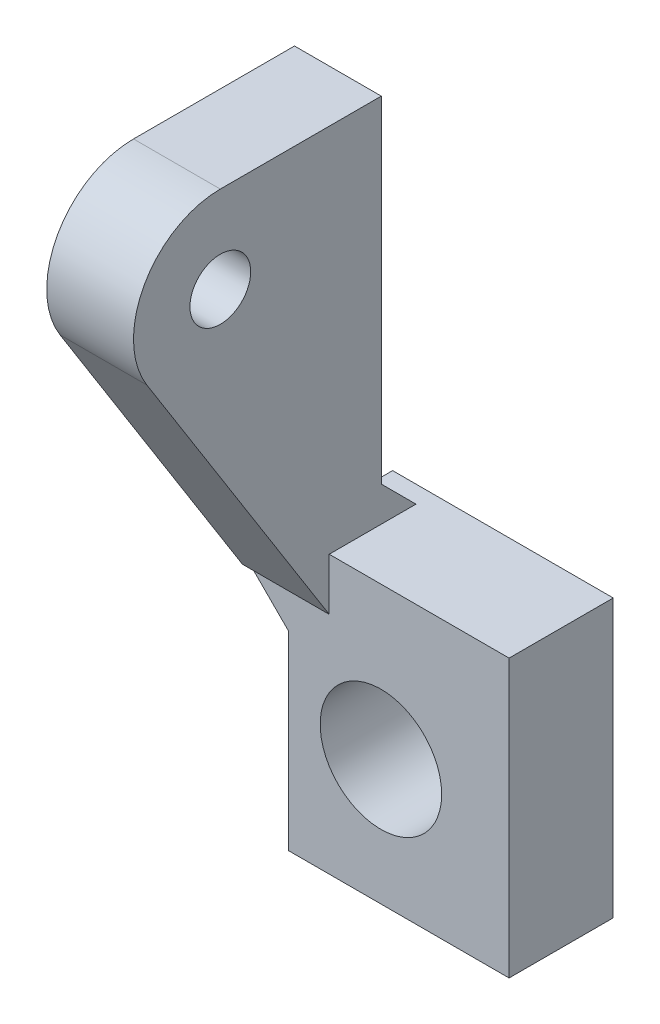
ISO-10303-21;
HEADER;
FILE_DESCRIPTION(('STEP AP214'),'2;1');
FILE_NAME('part.step','',(''),(''),'','','');
FILE_SCHEMA(('AUTOMOTIVE_DESIGN { 1 0 10303 214 1 1 1 1 }'));
ENDSEC;
DATA;
#1=APPLICATION_CONTEXT('core data for automotive mechanical design processes');
#2=APPLICATION_PROTOCOL_DEFINITION('international standard','automotive_design',2000,#1);
#3=PRODUCT_CONTEXT('',#1,'mechanical');
#4=PRODUCT('Part','Part','',(#3));
#5=PRODUCT_RELATED_PRODUCT_CATEGORY('part','',(#4));
#6=PRODUCT_DEFINITION_FORMATION('','',#4);
#7=PRODUCT_DEFINITION_CONTEXT('part definition',#1,'design');
#8=PRODUCT_DEFINITION('design','',#6,#7);
#9=PRODUCT_DEFINITION_SHAPE('','',#8);
#10=(LENGTH_UNIT() NAMED_UNIT(*) SI_UNIT(.MILLI.,.METRE.));
#11=(NAMED_UNIT(*) PLANE_ANGLE_UNIT() SI_UNIT($,.RADIAN.));
#12=(NAMED_UNIT(*) SI_UNIT($,.STERADIAN.) SOLID_ANGLE_UNIT());
#13=UNCERTAINTY_MEASURE_WITH_UNIT(LENGTH_MEASURE(1.E-05),#10,'distance_accuracy_value','');
#14=(GEOMETRIC_REPRESENTATION_CONTEXT(3) GLOBAL_UNCERTAINTY_ASSIGNED_CONTEXT((#13)) GLOBAL_UNIT_ASSIGNED_CONTEXT((#10,
#11,#12)) REPRESENTATION_CONTEXT('',''));
#15=CARTESIAN_POINT('',(0.,0.,0.));
#16=DIRECTION('',(0.,0.,1.));
#17=DIRECTION('',(1.,0.,0.));
#18=AXIS2_PLACEMENT_3D('',#15,#16,#17);
#19=CARTESIAN_POINT('',(0.,0.,47.41148));
#20=DIRECTION('',(0.,0.,-1.));
#21=DIRECTION('',(-1.,0.,0.));
#22=AXIS2_PLACEMENT_3D('',#19,#20,#21);
#23=PLANE('',#22);
#24=CARTESIAN_POINT('',(38.4788523967918,6.56657386274739,47.41148));
#25=DIRECTION('',(0.,0.,1.));
#26=DIRECTION('',(1.,0.,0.));
#27=AXIS2_PLACEMENT_3D('',#24,#25,#26);
#28=CIRCLE('',#27,1.8);
#29=CARTESIAN_POINT('',(40.2788523967918,6.56657386274739,47.41148));
#30=VERTEX_POINT('',#29);
#31=EDGE_CURVE('E221',#30,#30,#28,.T.);
#32=ORIENTED_EDGE('',*,*,#31,.F.);
#33=EDGE_LOOP('',(#32));
#34=FACE_BOUND('',#33,.T.);
#35=CARTESIAN_POINT('',(38.4788523967918,6.56657386274739,47.41148));
#36=DIRECTION('',(0.,0.,1.));
#37=DIRECTION('',(1.,0.,0.));
#38=AXIS2_PLACEMENT_3D('',#35,#36,#37);
#39=CIRCLE('',#38,3.5);
#40=CARTESIAN_POINT('',(41.9788523967918,6.56657386274739,47.41148));
#41=VERTEX_POINT('',#40);
#42=EDGE_CURVE('E279',#41,#41,#39,.T.);
#43=ORIENTED_EDGE('',*,*,#42,.T.);
#44=EDGE_LOOP('',(#43));
#45=FACE_BOUND('',#44,.T.);
#46=ADVANCED_FACE('F39',(#34,#45),#23,.F.);
#47=CARTESIAN_POINT('',(35.4999999999996,12.3085599551472,47.41148));
#48=DIRECTION('',(0.,1.,0.));
#49=DIRECTION('',(-1.,0.,0.));
#50=AXIS2_PLACEMENT_3D('',#47,#48,#49);
#51=PLANE('',#50);
#52=DIRECTION('',(-1.,0.,0.));
#53=VECTOR('',#52,1.);
#54=CARTESIAN_POINT('',(35.4999999999996,12.3085599551472,47.41148));
#55=LINE('',#54,#53);
#56=CARTESIAN_POINT('',(31.1528408173078,12.3085599551471,47.41148));
#57=VERTEX_POINT('',#56);
#58=CARTESIAN_POINT('',(30.4999999999996,12.3085599551471,47.41148));
#59=VERTEX_POINT('',#58);
#60=EDGE_CURVE('E212',#57,#59,#55,.T.);
#61=ORIENTED_EDGE('',*,*,#60,.F.);
#62=DIRECTION('',(0.,0.,1.));
#63=VECTOR('',#62,1.);
#64=CARTESIAN_POINT('',(31.1528408173078,12.3085599551471,52.41148));
#65=LINE('',#64,#63);
#66=CARTESIAN_POINT('',(31.1528408173078,12.3085599551471,52.41148));
#67=VERTEX_POINT('',#66);
#68=EDGE_CURVE('E242',#57,#67,#65,.T.);
#69=ORIENTED_EDGE('',*,*,#68,.T.);
#70=DIRECTION('',(-1.,0.,0.));
#71=VECTOR('',#70,1.);
#72=CARTESIAN_POINT('',(35.4999999999996,12.3085599551472,52.41148));
#73=LINE('',#72,#71);
#74=CARTESIAN_POINT('',(30.4999999999996,12.3085599551471,52.41148));
#75=VERTEX_POINT('',#74);
#76=EDGE_CURVE('E214',#67,#75,#73,.T.);
#77=ORIENTED_EDGE('',*,*,#76,.T.);
#78=DIRECTION('',(0.,0.,-1.));
#79=VECTOR('',#78,1.);
#80=CARTESIAN_POINT('',(30.4999999999996,12.3085599551471,47.41148));
#81=LINE('',#80,#79);
#82=EDGE_CURVE('E189',#75,#59,#81,.T.);
#83=ORIENTED_EDGE('',*,*,#82,.T.);
#84=EDGE_LOOP('',(#61,#69,#77,#83));
#85=FACE_BOUND('',#84,.T.);
#86=ADVANCED_FACE('F247',(#85),#51,.F.);
#87=CARTESIAN_POINT('',(0.,0.,46.41148));
#88=DIRECTION('',(0.,0.,-1.));
#89=DIRECTION('',(-1.,0.,0.));
#90=AXIS2_PLACEMENT_3D('',#87,#88,#89);
#91=PLANE('',#90);
#92=DIRECTION('',(0.,-1.,0.));
#93=VECTOR('',#92,1.);
#94=CARTESIAN_POINT('',(33.1528408173078,-0.654992050270078,46.41148));
#95=LINE('',#94,#93);
#96=CARTESIAN_POINT('',(33.1528408173078,15.3085599551472,46.41148));
#97=VERTEX_POINT('',#96);
#98=CARTESIAN_POINT('',(33.1528408173078,-0.654992050270078,46.41148));
#99=VERTEX_POINT('',#98);
#100=EDGE_CURVE('E150',#97,#99,#95,.T.);
#101=ORIENTED_EDGE('',*,*,#100,.F.);
#102=DIRECTION('',(-1.,0.,0.));
#103=VECTOR('',#102,1.);
#104=CARTESIAN_POINT('',(33.1528408173078,15.3085599551472,46.41148));
#105=LINE('',#104,#103);
#106=CARTESIAN_POINT('',(45.8637656044632,15.3085599551472,46.41148));
#107=VERTEX_POINT('',#106);
#108=EDGE_CURVE('E229',#107,#97,#105,.T.);
#109=ORIENTED_EDGE('',*,*,#108,.F.);
#110=DIRECTION('',(0.,1.,0.));
#111=VECTOR('',#110,1.);
#112=CARTESIAN_POINT('',(45.8637656044632,-0.654992050270078,46.41148));
#113=LINE('',#112,#111);
#114=CARTESIAN_POINT('',(45.8637656044632,-0.654992050270078,46.41148));
#115=VERTEX_POINT('',#114);
#116=EDGE_CURVE('E233',#115,#107,#113,.T.);
#117=ORIENTED_EDGE('',*,*,#116,.F.);
#118=DIRECTION('',(1.,0.,0.));
#119=VECTOR('',#118,1.);
#120=CARTESIAN_POINT('',(33.1528408173078,-0.654992050270078,46.41148));
#121=LINE('',#120,#119);
#122=EDGE_CURVE('E231',#99,#115,#121,.T.);
#123=ORIENTED_EDGE('',*,*,#122,.F.);
#124=EDGE_LOOP('',(#101,#109,#117,#123));
#125=FACE_BOUND('',#124,.T.);
#126=CARTESIAN_POINT('',(38.4788523967918,6.56657386274739,46.41148));
#127=DIRECTION('',(0.,0.,1.));
#128=DIRECTION('',(1.,0.,0.));
#129=AXIS2_PLACEMENT_3D('',#126,#127,#128);
#130=CIRCLE('',#129,1.8);
#131=CARTESIAN_POINT('',(40.2788523967918,6.56657386274739,46.41148));
#132=VERTEX_POINT('',#131);
#133=EDGE_CURVE('E220',#132,#132,#130,.T.);
#134=ORIENTED_EDGE('',*,*,#133,.T.);
#135=EDGE_LOOP('',(#134));
#136=FACE_BOUND('',#135,.T.);
#137=ADVANCED_FACE('F271',(#125,#136),#91,.T.);
#138=CARTESIAN_POINT('',(33.1528408173078,-0.654992050270078,47.41148));
#139=DIRECTION('',(1.,0.,0.));
#140=DIRECTION('',(0.,0.,-1.));
#141=AXIS2_PLACEMENT_3D('',#138,#139,#140);
#142=PLANE('',#141);
#143=DIRECTION('',(0.,-1.,0.));
#144=VECTOR('',#143,1.);
#145=CARTESIAN_POINT('',(33.1528408173078,12.3085599551471,52.41148));
#146=LINE('',#145,#144);
#147=CARTESIAN_POINT('',(33.1528408173078,10.3085599551471,52.41148));
#148=VERTEX_POINT('',#147);
#149=CARTESIAN_POINT('',(33.1528408173078,-0.654992050270078,52.41148));
#150=VERTEX_POINT('',#149);
#151=EDGE_CURVE('E129',#148,#150,#146,.T.);
#152=ORIENTED_EDGE('',*,*,#151,.F.);
#153=DIRECTION('',(0.,0.,-1.));
#154=VECTOR('',#153,1.);
#155=CARTESIAN_POINT('',(33.1528408173078,10.3085599551471,47.41148));
#156=LINE('',#155,#154);
#157=CARTESIAN_POINT('',(33.1528408173078,10.3085599551471,47.41148));
#158=VERTEX_POINT('',#157);
#159=EDGE_CURVE('E152',#148,#158,#156,.T.);
#160=ORIENTED_EDGE('',*,*,#159,.T.);
#161=DIRECTION('',(0.,-1.,0.));
#162=VECTOR('',#161,1.);
#163=CARTESIAN_POINT('',(33.1528408173078,-0.654992050270078,47.41148));
#164=LINE('',#163,#162);
#165=CARTESIAN_POINT('',(33.1528408173078,15.3085599551471,47.41148));
#166=VERTEX_POINT('',#165);
#167=EDGE_CURVE('E226',#166,#158,#164,.T.);
#168=ORIENTED_EDGE('',*,*,#167,.F.);
#169=DIRECTION('',(0.,0.,-1.));
#170=VECTOR('',#169,1.);
#171=CARTESIAN_POINT('',(33.1528408173078,15.3085599551472,47.41148));
#172=LINE('',#171,#170);
#173=EDGE_CURVE('E228',#166,#97,#172,.T.);
#174=ORIENTED_EDGE('',*,*,#173,.T.);
#175=ORIENTED_EDGE('',*,*,#100,.T.);
#176=DIRECTION('',(0.,0.,-1.));
#177=VECTOR('',#176,1.);
#178=CARTESIAN_POINT('',(33.1528408173078,-0.654992050270078,47.41148));
#179=LINE('',#178,#177);
#180=EDGE_CURVE('E146',#150,#99,#179,.T.);
#181=ORIENTED_EDGE('',*,*,#180,.F.);
#182=EDGE_LOOP('',(#152,#160,#168,#174,#175,#181));
#183=FACE_BOUND('',#182,.T.);
#184=ADVANCED_FACE('F147',(#183),#142,.F.);
#185=CARTESIAN_POINT('',(33.1528408173078,-0.654992050270078,47.41148));
#186=DIRECTION('',(0.,1.,0.));
#187=DIRECTION('',(0.,0.,1.));
#188=AXIS2_PLACEMENT_3D('',#185,#186,#187);
#189=PLANE('',#188);
#190=ORIENTED_EDGE('',*,*,#122,.T.);
#191=DIRECTION('',(0.,0.,-1.));
#192=VECTOR('',#191,1.);
#193=CARTESIAN_POINT('',(45.8637656044632,-0.654992050270078,47.41148));
#194=LINE('',#193,#192);
#195=CARTESIAN_POINT('',(45.8637656044632,-0.654992050270078,52.41148));
#196=VERTEX_POINT('',#195);
#197=EDGE_CURVE('E153',#196,#115,#194,.T.);
#198=ORIENTED_EDGE('',*,*,#197,.F.);
#199=DIRECTION('',(1.,0.,0.));
#200=VECTOR('',#199,1.);
#201=CARTESIAN_POINT('',(33.1528408173078,-0.654992050270078,52.41148));
#202=LINE('',#201,#200);
#203=EDGE_CURVE('E136',#150,#196,#202,.T.);
#204=ORIENTED_EDGE('',*,*,#203,.F.);
#205=ORIENTED_EDGE('',*,*,#180,.T.);
#206=EDGE_LOOP('',(#190,#198,#204,#205));
#207=FACE_BOUND('',#206,.T.);
#208=ADVANCED_FACE('F155',(#207),#189,.F.);
#209=CARTESIAN_POINT('',(45.8637656044632,-0.654992050270078,47.41148));
#210=DIRECTION('',(-1.,0.,0.));
#211=DIRECTION('',(0.,0.,1.));
#212=AXIS2_PLACEMENT_3D('',#209,#210,#211);
#213=PLANE('',#212);
#214=ORIENTED_EDGE('',*,*,#116,.T.);
#215=DIRECTION('',(0.,0.,-1.));
#216=VECTOR('',#215,1.);
#217=CARTESIAN_POINT('',(45.8637656044632,15.3085599551472,47.41148));
#218=LINE('',#217,#216);
#219=CARTESIAN_POINT('',(45.8637656044632,15.3085599551472,52.41148));
#220=VERTEX_POINT('',#219);
#221=EDGE_CURVE('E237',#220,#107,#218,.T.);
#222=ORIENTED_EDGE('',*,*,#221,.F.);
#223=DIRECTION('',(0.,1.,0.));
#224=VECTOR('',#223,1.);
#225=CARTESIAN_POINT('',(45.8637656044632,-0.654992050270078,52.41148));
#226=LINE('',#225,#224);
#227=EDGE_CURVE('E157',#196,#220,#226,.T.);
#228=ORIENTED_EDGE('',*,*,#227,.F.);
#229=ORIENTED_EDGE('',*,*,#197,.T.);
#230=EDGE_LOOP('',(#214,#222,#228,#229));
#231=FACE_BOUND('',#230,.T.);
#232=ADVANCED_FACE('F274',(#231),#213,.F.);
#233=CARTESIAN_POINT('',(33.1528408173078,15.3085599551472,47.41148));
#234=DIRECTION('',(0.,-1.,0.));
#235=DIRECTION('',(0.,0.,-1.));
#236=AXIS2_PLACEMENT_3D('',#233,#234,#235);
#237=PLANE('',#236);
#238=ORIENTED_EDGE('',*,*,#108,.T.);
#239=ORIENTED_EDGE('',*,*,#173,.F.);
#240=DIRECTION('',(-1.,0.,0.));
#241=VECTOR('',#240,1.);
#242=CARTESIAN_POINT('',(35.4999999999996,15.3085599551472,47.41148));
#243=LINE('',#242,#241);
#244=CARTESIAN_POINT('',(35.4999999999996,15.3085599551472,47.41148));
#245=VERTEX_POINT('',#244);
#246=EDGE_CURVE('E209',#245,#166,#243,.T.);
#247=ORIENTED_EDGE('',*,*,#246,.F.);
#248=DIRECTION('',(0.,0.,-1.));
#249=VECTOR('',#248,1.);
#250=CARTESIAN_POINT('',(35.4999999999996,15.3085599551472,52.41148));
#251=LINE('',#250,#249);
#252=CARTESIAN_POINT('',(35.4999999999996,15.3085599551472,52.41148));
#253=VERTEX_POINT('',#252);
#254=EDGE_CURVE('E159',#253,#245,#251,.T.);
#255=ORIENTED_EDGE('',*,*,#254,.F.);
#256=DIRECTION('',(-1.,0.,0.));
#257=VECTOR('',#256,1.);
#258=CARTESIAN_POINT('',(45.8637656044632,15.3085599551472,52.41148));
#259=LINE('',#258,#257);
#260=EDGE_CURVE('E275',#220,#253,#259,.T.);
#261=ORIENTED_EDGE('',*,*,#260,.F.);
#262=ORIENTED_EDGE('',*,*,#221,.T.);
#263=EDGE_LOOP('',(#238,#239,#247,#255,#261,#262));
#264=FACE_BOUND('',#263,.T.);
#265=ADVANCED_FACE('F266',(#264),#237,.F.);
#266=CARTESIAN_POINT('',(38.4788523967918,6.56657386274739,47.41148));
#267=DIRECTION('',(0.,0.,-1.));
#268=DIRECTION('',(-1.,0.,0.));
#269=AXIS2_PLACEMENT_3D('',#266,#267,#268);
#270=CYLINDRICAL_SURFACE('',#269,1.8);
#271=ORIENTED_EDGE('',*,*,#31,.T.);
#272=EDGE_LOOP('',(#271));
#273=FACE_BOUND('',#272,.T.);
#274=ORIENTED_EDGE('',*,*,#133,.F.);
#275=EDGE_LOOP('',(#274));
#276=FACE_BOUND('',#275,.T.);
#277=ADVANCED_FACE('F306',(#273,#276),#270,.F.);
#278=CARTESIAN_POINT('',(35.4999999999996,15.3085599551472,47.41148));
#279=DIRECTION('',(0.,0.,1.));
#280=DIRECTION('',(1.,0.,0.));
#281=AXIS2_PLACEMENT_3D('',#278,#279,#280);
#282=PLANE('',#281);
#283=CARTESIAN_POINT('',(30.4999999999996,15.3085599551471,47.41148));
#284=VERTEX_POINT('',#283);
#285=EDGE_CURVE('E208',#166,#284,#243,.T.);
#286=ORIENTED_EDGE('',*,*,#285,.F.);
#287=ORIENTED_EDGE('',*,*,#167,.T.);
#288=DIRECTION('',(0.707106781186544,-0.707106781186551,0.));
#289=VECTOR('',#288,1.);
#290=CARTESIAN_POINT('',(31.8264204086537,11.6349803638013,47.41148));
#291=LINE('',#290,#289);
#292=EDGE_CURVE('E49',#158,#57,#291,.F.);
#293=ORIENTED_EDGE('',*,*,#292,.T.);
#294=ORIENTED_EDGE('',*,*,#60,.T.);
#295=DIRECTION('',(0.,1.,0.));
#296=VECTOR('',#295,1.);
#297=CARTESIAN_POINT('',(30.4999999999996,15.3085599551471,47.41148));
#298=LINE('',#297,#296);
#299=EDGE_CURVE('E192',#59,#284,#298,.T.);
#300=ORIENTED_EDGE('',*,*,#299,.T.);
#301=EDGE_LOOP('',(#286,#287,#293,#294,#300));
#302=FACE_BOUND('',#301,.T.);
#303=ADVANCED_FACE('F256',(#302),#282,.F.);
#304=CARTESIAN_POINT('',(35.4999999999996,31.668712622196,58.6878312261396));
#305=DIRECTION('',(1.,0.,0.));
#306=DIRECTION('',(0.,0.,-1.));
#307=AXIS2_PLACEMENT_3D('',#304,#305,#306);
#308=PLANE('',#307);
#309=DIRECTION('',(0.,-1.,0.));
#310=VECTOR('',#309,1.);
#311=CARTESIAN_POINT('',(35.4999999999996,15.3085599551472,52.41148));
#312=LINE('',#311,#310);
#313=CARTESIAN_POINT('',(35.4999999999996,12.3085599551472,52.41148));
#314=VERTEX_POINT('',#313);
#315=EDGE_CURVE('E142',#253,#314,#312,.T.);
#316=ORIENTED_EDGE('',*,*,#315,.F.);
#317=ORIENTED_EDGE('',*,*,#254,.T.);
#318=DIRECTION('',(0.,0.707106781186547,0.707106781186548));
#319=VECTOR('',#318,1.);
#320=CARTESIAN_POINT('',(35.4999999999996,17.3085599551471,49.41148));
#321=LINE('',#320,#319);
#322=CARTESIAN_POINT('',(35.4999999999996,17.3085599551471,49.41148));
#323=VERTEX_POINT('',#322);
#324=EDGE_CURVE('E177',#245,#323,#321,.T.);
#325=ORIENTED_EDGE('',*,*,#324,.T.);
#326=DIRECTION('',(0.,1.,0.));
#327=VECTOR('',#326,1.);
#328=CARTESIAN_POINT('',(35.4999999999996,36.668712622196,49.41148));
#329=LINE('',#328,#327);
#330=CARTESIAN_POINT('',(35.4999999999996,36.668712622196,49.41148));
#331=VERTEX_POINT('',#330);
#332=EDGE_CURVE('E179',#323,#331,#329,.T.);
#333=ORIENTED_EDGE('',*,*,#332,.T.);
#334=DIRECTION('',(0.,0.,1.));
#335=VECTOR('',#334,1.);
#336=CARTESIAN_POINT('',(35.4999999999996,36.668712622196,58.6878312261396));
#337=LINE('',#336,#335);
#338=CARTESIAN_POINT('',(35.4999999999996,36.668712622196,58.6878312261396));
#339=VERTEX_POINT('',#338);
#340=EDGE_CURVE('E181',#331,#339,#337,.T.);
#341=ORIENTED_EDGE('',*,*,#340,.T.);
#342=CARTESIAN_POINT('',(35.4999999999996,31.668712622196,58.6878312261396));
#343=DIRECTION('',(1.,0.,0.));
#344=DIRECTION('',(0.,0.,-1.));
#345=AXIS2_PLACEMENT_3D('',#342,#343,#344);
#346=CIRCLE('',#345,5.);
#347=CARTESIAN_POINT('',(35.4999999999996,29.0055239103009,62.9195478854677));
#348=VERTEX_POINT('',#347);
#349=EDGE_CURVE('E171',#339,#348,#346,.T.);
#350=ORIENTED_EDGE('',*,*,#349,.T.);
#351=DIRECTION('',(0.,-0.846343331865617,-0.532637742379008));
#352=VECTOR('',#351,1.);
#353=CARTESIAN_POINT('',(35.4999999999996,12.3085599551472,52.41148));
#354=LINE('',#353,#352);
#355=EDGE_CURVE('E174',#348,#314,#354,.T.);
#356=ORIENTED_EDGE('',*,*,#355,.T.);
#357=EDGE_LOOP('',(#316,#317,#325,#333,#341,#350,#356));
#358=FACE_BOUND('',#357,.T.);
#359=CARTESIAN_POINT('',(35.4999999999996,31.668712622196,58.6878312261396));
#360=DIRECTION('',(1.,0.,0.));
#361=DIRECTION('',(0.,0.,-1.));
#362=AXIS2_PLACEMENT_3D('',#359,#360,#361);
#363=CIRCLE('',#362,1.75);
#364=CARTESIAN_POINT('',(35.4999999999996,31.668712622196,56.9378312261396));
#365=VERTEX_POINT('',#364);
#366=EDGE_CURVE('E165',#365,#365,#363,.T.);
#367=ORIENTED_EDGE('',*,*,#366,.F.);
#368=EDGE_LOOP('',(#367));
#369=FACE_BOUND('',#368,.T.);
#370=ADVANCED_FACE('F347',(#358,#369),#308,.T.);
#371=CARTESIAN_POINT('',(30.4999999999996,31.668712622196,58.6878312261396));
#372=DIRECTION('',(1.,0.,0.));
#373=DIRECTION('',(0.,0.,-1.));
#374=AXIS2_PLACEMENT_3D('',#371,#372,#373);
#375=PLANE('',#374);
#376=CARTESIAN_POINT('',(30.4999999999996,31.668712622196,58.6878312261396));
#377=DIRECTION('',(1.,0.,0.));
#378=DIRECTION('',(0.,0.,-1.));
#379=AXIS2_PLACEMENT_3D('',#376,#377,#378);
#380=CIRCLE('',#379,5.);
#381=CARTESIAN_POINT('',(30.4999999999996,36.668712622196,58.6878312261396));
#382=VERTEX_POINT('',#381);
#383=CARTESIAN_POINT('',(30.4999999999996,29.0055239103009,62.9195478854677));
#384=VERTEX_POINT('',#383);
#385=EDGE_CURVE('E168',#382,#384,#380,.T.);
#386=ORIENTED_EDGE('',*,*,#385,.F.);
#387=DIRECTION('',(0.,0.,1.));
#388=VECTOR('',#387,1.);
#389=CARTESIAN_POINT('',(30.4999999999996,36.668712622196,58.6878312261396));
#390=LINE('',#389,#388);
#391=CARTESIAN_POINT('',(30.4999999999996,36.668712622196,49.41148));
#392=VERTEX_POINT('',#391);
#393=EDGE_CURVE('E175',#392,#382,#390,.T.);
#394=ORIENTED_EDGE('',*,*,#393,.F.);
#395=DIRECTION('',(0.,1.,0.));
#396=VECTOR('',#395,1.);
#397=CARTESIAN_POINT('',(30.4999999999996,36.668712622196,49.41148));
#398=LINE('',#397,#396);
#399=CARTESIAN_POINT('',(30.4999999999996,17.3085599551471,49.41148));
#400=VERTEX_POINT('',#399);
#401=EDGE_CURVE('E197',#400,#392,#398,.T.);
#402=ORIENTED_EDGE('',*,*,#401,.F.);
#403=DIRECTION('',(0.,0.707106781186547,0.707106781186548));
#404=VECTOR('',#403,1.);
#405=CARTESIAN_POINT('',(30.4999999999996,17.3085599551471,49.41148));
#406=LINE('',#405,#404);
#407=EDGE_CURVE('E195',#284,#400,#406,.T.);
#408=ORIENTED_EDGE('',*,*,#407,.F.);
#409=ORIENTED_EDGE('',*,*,#299,.F.);
#410=ORIENTED_EDGE('',*,*,#82,.F.);
#411=DIRECTION('',(0.,-0.846343331865617,-0.532637742379008));
#412=VECTOR('',#411,1.);
#413=CARTESIAN_POINT('',(30.4999999999996,12.3085599551471,52.41148));
#414=LINE('',#413,#412);
#415=EDGE_CURVE('E186',#384,#75,#414,.T.);
#416=ORIENTED_EDGE('',*,*,#415,.F.);
#417=EDGE_LOOP('',(#386,#394,#402,#408,#409,#410,#416));
#418=FACE_BOUND('',#417,.T.);
#419=CARTESIAN_POINT('',(30.4999999999996,31.668712622196,58.6878312261396));
#420=DIRECTION('',(1.,0.,0.));
#421=DIRECTION('',(0.,0.,-1.));
#422=AXIS2_PLACEMENT_3D('',#419,#420,#421);
#423=CIRCLE('',#422,1.75);
#424=CARTESIAN_POINT('',(30.4999999999996,31.668712622196,56.9378312261396));
#425=VERTEX_POINT('',#424);
#426=EDGE_CURVE('E164',#425,#425,#423,.T.);
#427=ORIENTED_EDGE('',*,*,#426,.T.);
#428=EDGE_LOOP('',(#427));
#429=FACE_BOUND('',#428,.T.);
#430=ADVANCED_FACE('F354',(#418,#429),#375,.F.);
#431=CARTESIAN_POINT('',(35.4999999999996,31.668712622196,58.6878312261396));
#432=DIRECTION('',(-1.,0.,0.));
#433=DIRECTION('',(0.,0.,1.));
#434=AXIS2_PLACEMENT_3D('',#431,#432,#433);
#435=CYLINDRICAL_SURFACE('',#434,5.);
#436=ORIENTED_EDGE('',*,*,#385,.T.);
#437=DIRECTION('',(-1.,0.,0.));
#438=VECTOR('',#437,1.);
#439=CARTESIAN_POINT('',(35.4999999999996,29.0055239103009,62.9195478854677));
#440=LINE('',#439,#438);
#441=EDGE_CURVE('E217',#348,#384,#440,.T.);
#442=ORIENTED_EDGE('',*,*,#441,.F.);
#443=ORIENTED_EDGE('',*,*,#349,.F.);
#444=DIRECTION('',(-1.,0.,0.));
#445=VECTOR('',#444,1.);
#446=CARTESIAN_POINT('',(35.4999999999996,36.668712622196,58.6878312261396));
#447=LINE('',#446,#445);
#448=EDGE_CURVE('E183',#339,#382,#447,.T.);
#449=ORIENTED_EDGE('',*,*,#448,.T.);
#450=EDGE_LOOP('',(#436,#442,#443,#449));
#451=FACE_BOUND('',#450,.T.);
#452=ADVANCED_FACE('F362',(#451),#435,.T.);
#453=CARTESIAN_POINT('',(35.4999999999996,12.3085599551472,52.41148));
#454=DIRECTION('',(0.,0.532637742379008,-0.846343331865617));
#455=DIRECTION('',(0.,0.846343331865617,0.532637742379008));
#456=AXIS2_PLACEMENT_3D('',#453,#454,#455);
#457=PLANE('',#456);
#458=ORIENTED_EDGE('',*,*,#415,.T.);
#459=ORIENTED_EDGE('',*,*,#76,.F.);
#460=EDGE_CURVE('E215',#314,#67,#73,.T.);
#461=ORIENTED_EDGE('',*,*,#460,.F.);
#462=ORIENTED_EDGE('',*,*,#355,.F.);
#463=ORIENTED_EDGE('',*,*,#441,.T.);
#464=EDGE_LOOP('',(#458,#459,#461,#462,#463));
#465=FACE_BOUND('',#464,.T.);
#466=ADVANCED_FACE('F251',(#465),#457,.F.);
#467=CARTESIAN_POINT('',(35.4999999999996,17.3085599551471,49.41148));
#468=DIRECTION('',(0.,-0.707106781186548,0.707106781186547));
#469=DIRECTION('',(0.,-0.707106781186547,-0.707106781186548));
#470=AXIS2_PLACEMENT_3D('',#467,#468,#469);
#471=PLANE('',#470);
#472=ORIENTED_EDGE('',*,*,#407,.T.);
#473=DIRECTION('',(-1.,0.,0.));
#474=VECTOR('',#473,1.);
#475=CARTESIAN_POINT('',(35.4999999999996,17.3085599551471,49.41148));
#476=LINE('',#475,#474);
#477=EDGE_CURVE('E205',#323,#400,#476,.T.);
#478=ORIENTED_EDGE('',*,*,#477,.F.);
#479=ORIENTED_EDGE('',*,*,#324,.F.);
#480=ORIENTED_EDGE('',*,*,#246,.T.);
#481=ORIENTED_EDGE('',*,*,#285,.T.);
#482=EDGE_LOOP('',(#472,#478,#479,#480,#481));
#483=FACE_BOUND('',#482,.T.);
#484=ADVANCED_FACE('F262',(#483),#471,.F.);
#485=CARTESIAN_POINT('',(35.4999999999996,36.668712622196,49.41148));
#486=DIRECTION('',(0.,0.,1.));
#487=DIRECTION('',(1.,0.,0.));
#488=AXIS2_PLACEMENT_3D('',#485,#486,#487);
#489=PLANE('',#488);
#490=ORIENTED_EDGE('',*,*,#401,.T.);
#491=DIRECTION('',(-1.,0.,0.));
#492=VECTOR('',#491,1.);
#493=CARTESIAN_POINT('',(35.4999999999996,36.668712622196,49.41148));
#494=LINE('',#493,#492);
#495=EDGE_CURVE('E202',#331,#392,#494,.T.);
#496=ORIENTED_EDGE('',*,*,#495,.F.);
#497=ORIENTED_EDGE('',*,*,#332,.F.);
#498=ORIENTED_EDGE('',*,*,#477,.T.);
#499=EDGE_LOOP('',(#490,#496,#497,#498));
#500=FACE_BOUND('',#499,.T.);
#501=ADVANCED_FACE('F382',(#500),#489,.F.);
#502=CARTESIAN_POINT('',(35.4999999999996,36.668712622196,58.6878312261396));
#503=DIRECTION('',(0.,-1.,0.));
#504=DIRECTION('',(1.,0.,0.));
#505=AXIS2_PLACEMENT_3D('',#502,#503,#504);
#506=PLANE('',#505);
#507=ORIENTED_EDGE('',*,*,#393,.T.);
#508=ORIENTED_EDGE('',*,*,#448,.F.);
#509=ORIENTED_EDGE('',*,*,#340,.F.);
#510=ORIENTED_EDGE('',*,*,#495,.T.);
#511=EDGE_LOOP('',(#507,#508,#509,#510));
#512=FACE_BOUND('',#511,.T.);
#513=ADVANCED_FACE('F388',(#512),#506,.F.);
#514=CARTESIAN_POINT('',(35.4999999999996,31.668712622196,58.6878312261396));
#515=DIRECTION('',(-1.,0.,0.));
#516=DIRECTION('',(0.,0.,1.));
#517=AXIS2_PLACEMENT_3D('',#514,#515,#516);
#518=CYLINDRICAL_SURFACE('',#517,1.75);
#519=ORIENTED_EDGE('',*,*,#366,.T.);
#520=EDGE_LOOP('',(#519));
#521=FACE_BOUND('',#520,.T.);
#522=ORIENTED_EDGE('',*,*,#426,.F.);
#523=EDGE_LOOP('',(#522));
#524=FACE_BOUND('',#523,.T.);
#525=ADVANCED_FACE('F294',(#521,#524),#518,.F.);
#526=CARTESIAN_POINT('',(0.,0.,52.41148));
#527=DIRECTION('',(0.,0.,1.));
#528=DIRECTION('',(1.,0.,0.));
#529=AXIS2_PLACEMENT_3D('',#526,#527,#528);
#530=PLANE('',#529);
#531=ORIENTED_EDGE('',*,*,#260,.T.);
#532=ORIENTED_EDGE('',*,*,#315,.T.);
#533=ORIENTED_EDGE('',*,*,#460,.T.);
#534=DIRECTION('',(-0.707106781186544,0.707106781186551,0.));
#535=VECTOR('',#534,1.);
#536=CARTESIAN_POINT('',(33.1528408173078,10.3085599551471,52.41148));
#537=LINE('',#536,#535);
#538=EDGE_CURVE('E11',#67,#148,#537,.F.);
#539=ORIENTED_EDGE('',*,*,#538,.T.);
#540=ORIENTED_EDGE('',*,*,#151,.T.);
#541=ORIENTED_EDGE('',*,*,#203,.T.);
#542=ORIENTED_EDGE('',*,*,#227,.T.);
#543=EDGE_LOOP('',(#531,#532,#533,#539,#540,#541,#542));
#544=FACE_BOUND('',#543,.T.);
#545=CARTESIAN_POINT('',(38.4788523967918,6.56657386274739,52.41148));
#546=DIRECTION('',(0.,0.,1.));
#547=DIRECTION('',(1.,0.,0.));
#548=AXIS2_PLACEMENT_3D('',#545,#546,#547);
#549=CIRCLE('',#548,3.5);
#550=CARTESIAN_POINT('',(41.9788523967918,6.56657386274739,52.41148));
#551=VERTEX_POINT('',#550);
#552=EDGE_CURVE('E276',#551,#551,#549,.T.);
#553=ORIENTED_EDGE('',*,*,#552,.F.);
#554=EDGE_LOOP('',(#553));
#555=FACE_BOUND('',#554,.T.);
#556=ADVANCED_FACE('F132',(#544,#555),#530,.T.);
#557=CARTESIAN_POINT('',(38.4788523967918,6.56657386274739,52.41148));
#558=DIRECTION('',(0.,0.,-1.));
#559=DIRECTION('',(-1.,0.,0.));
#560=AXIS2_PLACEMENT_3D('',#557,#558,#559);
#561=CYLINDRICAL_SURFACE('',#560,3.5);
#562=ORIENTED_EDGE('',*,*,#552,.T.);
#563=EDGE_LOOP('',(#562));
#564=FACE_BOUND('',#563,.T.);
#565=ORIENTED_EDGE('',*,*,#42,.F.);
#566=EDGE_LOOP('',(#565));
#567=FACE_BOUND('',#566,.T.);
#568=ADVANCED_FACE('F286',(#564,#567),#561,.F.);
#569=CARTESIAN_POINT('',(33.1528408173078,10.3085599551471,47.41148));
#570=DIRECTION('',(-0.707106781186551,-0.707106781186544,0.));
#571=DIRECTION('',(0.,0.,1.));
#572=AXIS2_PLACEMENT_3D('',#569,#570,#571);
#573=PLANE('',#572);
#574=ORIENTED_EDGE('',*,*,#538,.F.);
#575=ORIENTED_EDGE('',*,*,#68,.F.);
#576=ORIENTED_EDGE('',*,*,#292,.F.);
#577=ORIENTED_EDGE('',*,*,#159,.F.);
#578=EDGE_LOOP('',(#574,#575,#576,#577));
#579=FACE_BOUND('',#578,.T.);
#580=ADVANCED_FACE('F42',(#579),#573,.T.);
#581=CLOSED_SHELL('',(#46,#86,#137,#184,#208,#232,#265,#277,#303,#370,#430,#452,#466,#484,#501,
#513,#525,#556,#568,#580));
#582=MANIFOLD_SOLID_BREP('B2',#581);
#583=ADVANCED_BREP_SHAPE_REPRESENTATION('',(#18,#582),#14);
#584=SHAPE_DEFINITION_REPRESENTATION(#9,#583);
ENDSEC;
END-ISO-10303-21;
